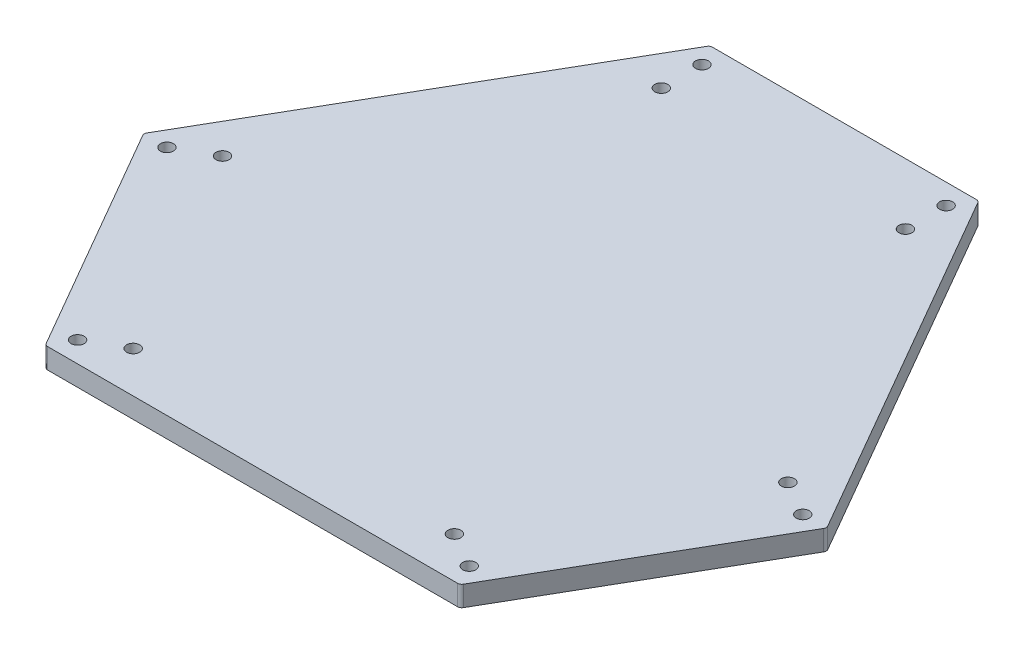
ISO-10303-21;
HEADER;
FILE_DESCRIPTION(('STEP AP214'),'2;1');
FILE_NAME('part.step','',(''),(''),'','','');
FILE_SCHEMA(('AUTOMOTIVE_DESIGN { 1 0 10303 214 1 1 1 1 }'));
ENDSEC;
DATA;
#1=APPLICATION_CONTEXT('core data for automotive mechanical design processes');
#2=APPLICATION_PROTOCOL_DEFINITION('international standard','automotive_design',2000,#1);
#3=PRODUCT_CONTEXT('',#1,'mechanical');
#4=PRODUCT('Part','Part','',(#3));
#5=PRODUCT_RELATED_PRODUCT_CATEGORY('part','',(#4));
#6=PRODUCT_DEFINITION_FORMATION('','',#4);
#7=PRODUCT_DEFINITION_CONTEXT('part definition',#1,'design');
#8=PRODUCT_DEFINITION('design','',#6,#7);
#9=PRODUCT_DEFINITION_SHAPE('','',#8);
#10=(LENGTH_UNIT() NAMED_UNIT(*) SI_UNIT(.MILLI.,.METRE.));
#11=(NAMED_UNIT(*) PLANE_ANGLE_UNIT() SI_UNIT($,.RADIAN.));
#12=(NAMED_UNIT(*) SI_UNIT($,.STERADIAN.) SOLID_ANGLE_UNIT());
#13=UNCERTAINTY_MEASURE_WITH_UNIT(LENGTH_MEASURE(1.E-05),#10,'distance_accuracy_value','');
#14=(GEOMETRIC_REPRESENTATION_CONTEXT(3) GLOBAL_UNCERTAINTY_ASSIGNED_CONTEXT((#13)) GLOBAL_UNIT_ASSIGNED_CONTEXT((#10,
#11,#12)) REPRESENTATION_CONTEXT('',''));
#15=CARTESIAN_POINT('',(0.,0.,0.));
#16=DIRECTION('',(0.,0.,1.));
#17=DIRECTION('',(1.,0.,0.));
#18=AXIS2_PLACEMENT_3D('',#15,#16,#17);
#19=CARTESIAN_POINT('',(-33.,2.5,-77.8999999999996));
#20=DIRECTION('',(0.86602540378444,0.,0.499999999999997));
#21=DIRECTION('',(0.499999999999997,0.,-0.86602540378444));
#22=AXIS2_PLACEMENT_3D('',#19,#20,#21);
#23=PLANE('',#22);
#24=DIRECTION('',(-0.499999999999997,0.,0.86602540378444));
#25=VECTOR('',#24,1.);
#26=CARTESIAN_POINT('',(-33.,2.5,-77.8999999999996));
#27=LINE('',#26,#25);
#28=CARTESIAN_POINT('',(-33.2886751345948,2.5,-77.3999999999996));
#29=VERTEX_POINT('',#28);
#30=CARTESIAN_POINT('',(-83.6747038202125,2.5,9.87116167511386));
#31=VERTEX_POINT('',#30);
#32=EDGE_CURVE('E149',#29,#31,#27,.T.);
#33=ORIENTED_EDGE('',*,*,#32,.F.);
#34=DIRECTION('',(0.,-1.,0.));
#35=VECTOR('',#34,1.);
#36=CARTESIAN_POINT('',(-33.2886751345948,2.5,-77.3999999999996));
#37=LINE('',#36,#35);
#38=CARTESIAN_POINT('',(-33.2886751345948,-2.5,-77.3999999999996));
#39=VERTEX_POINT('',#38);
#40=EDGE_CURVE('E134',#29,#39,#37,.T.);
#41=ORIENTED_EDGE('',*,*,#40,.T.);
#42=DIRECTION('',(-0.499999999999997,0.,0.86602540378444));
#43=VECTOR('',#42,1.);
#44=CARTESIAN_POINT('',(-33.,-2.5,-77.8999999999996));
#45=LINE('',#44,#43);
#46=CARTESIAN_POINT('',(-83.6747038202125,-2.5,9.87116167511386));
#47=VERTEX_POINT('',#46);
#48=EDGE_CURVE('E146',#39,#47,#45,.T.);
#49=ORIENTED_EDGE('',*,*,#48,.T.);
#50=DIRECTION('',(0.,-1.,0.));
#51=VECTOR('',#50,1.);
#52=CARTESIAN_POINT('',(-83.6747038202125,2.5,9.87116167511386));
#53=LINE('',#52,#51);
#54=EDGE_CURVE('E151',#47,#31,#53,.F.);
#55=ORIENTED_EDGE('',*,*,#54,.T.);
#56=EDGE_LOOP('',(#33,#41,#49,#55));
#57=FACE_BOUND('',#56,.T.);
#58=ADVANCED_FACE('F39',(#57),#23,.F.);
#59=CARTESIAN_POINT('',(-83.9633789548074,2.5,10.3711616751139));
#60=DIRECTION('',(0.866025403784435,0.,-0.500000000000006));
#61=DIRECTION('',(-0.500000000000006,0.,-0.866025403784435));
#62=AXIS2_PLACEMENT_3D('',#59,#60,#61);
#63=PLANE('',#62);
#64=DIRECTION('',(0.500000000000005,0.,0.866025403784435));
#65=VECTOR('',#64,1.);
#66=CARTESIAN_POINT('',(-83.9633789548074,2.5,10.3711616751139));
#67=LINE('',#66,#65);
#68=CARTESIAN_POINT('',(-83.6747038202125,2.5,10.8711616751139));
#69=VERTEX_POINT('',#68);
#70=CARTESIAN_POINT('',(-51.2520540894018,2.5,67.0288383248866));
#71=VERTEX_POINT('',#70);
#72=EDGE_CURVE('E218',#69,#71,#67,.T.);
#73=ORIENTED_EDGE('',*,*,#72,.F.);
#74=DIRECTION('',(0.,-1.,0.));
#75=VECTOR('',#74,1.);
#76=CARTESIAN_POINT('',(-83.6747038202125,2.5,10.8711616751139));
#77=LINE('',#76,#75);
#78=CARTESIAN_POINT('',(-83.6747038202125,-2.5,10.8711616751139));
#79=VERTEX_POINT('',#78);
#80=EDGE_CURVE('E11',#69,#79,#77,.T.);
#81=ORIENTED_EDGE('',*,*,#80,.T.);
#82=DIRECTION('',(0.500000000000005,0.,0.866025403784435));
#83=VECTOR('',#82,1.);
#84=CARTESIAN_POINT('',(-83.9633789548074,-2.5,10.3711616751139));
#85=LINE('',#84,#83);
#86=CARTESIAN_POINT('',(-51.2520540894018,-2.5,67.0288383248866));
#87=VERTEX_POINT('',#86);
#88=EDGE_CURVE('E156',#79,#87,#85,.T.);
#89=ORIENTED_EDGE('',*,*,#88,.T.);
#90=DIRECTION('',(0.,-1.,0.));
#91=VECTOR('',#90,1.);
#92=CARTESIAN_POINT('',(-51.2520540894018,2.5,67.0288383248866));
#93=LINE('',#92,#91);
#94=EDGE_CURVE('E47',#87,#71,#93,.F.);
#95=ORIENTED_EDGE('',*,*,#94,.T.);
#96=EDGE_LOOP('',(#73,#81,#89,#95));
#97=FACE_BOUND('',#96,.T.);
#98=ADVANCED_FACE('F217',(#97),#63,.F.);
#99=CARTESIAN_POINT('',(-50.963378954807,2.5,67.5288383248866));
#100=DIRECTION('',(0.,0.,-1.));
#101=DIRECTION('',(-1.,0.,0.));
#102=AXIS2_PLACEMENT_3D('',#99,#100,#101);
#103=PLANE('',#102);
#104=DIRECTION('',(1.,0.,0.));
#105=VECTOR('',#104,1.);
#106=CARTESIAN_POINT('',(-50.963378954807,-2.5,67.5288383248866));
#107=LINE('',#106,#105);
#108=CARTESIAN_POINT('',(-50.3860286856174,-2.5,67.5288383248866));
#109=VERTEX_POINT('',#108);
#110=CARTESIAN_POINT('',(50.3860286856174,-2.5,67.5288383248866));
#111=VERTEX_POINT('',#110);
#112=EDGE_CURVE('E160',#109,#111,#107,.T.);
#113=ORIENTED_EDGE('',*,*,#112,.T.);
#114=DIRECTION('',(0.,-1.,0.));
#115=VECTOR('',#114,1.);
#116=CARTESIAN_POINT('',(50.3860286856174,2.5,67.5288383248866));
#117=LINE('',#116,#115);
#118=CARTESIAN_POINT('',(50.3860286856174,2.5,67.5288383248866));
#119=VERTEX_POINT('',#118);
#120=EDGE_CURVE('E212',#111,#119,#117,.F.);
#121=ORIENTED_EDGE('',*,*,#120,.T.);
#122=DIRECTION('',(1.,0.,0.));
#123=VECTOR('',#122,1.);
#124=CARTESIAN_POINT('',(-50.963378954807,2.5,67.5288383248866));
#125=LINE('',#124,#123);
#126=CARTESIAN_POINT('',(-50.3860286856174,2.5,67.5288383248866));
#127=VERTEX_POINT('',#126);
#128=EDGE_CURVE('E227',#127,#119,#125,.T.);
#129=ORIENTED_EDGE('',*,*,#128,.F.);
#130=DIRECTION('',(0.,-1.,0.));
#131=VECTOR('',#130,1.);
#132=CARTESIAN_POINT('',(-50.3860286856174,2.5,67.5288383248866));
#133=LINE('',#132,#131);
#134=EDGE_CURVE('E209',#127,#109,#133,.T.);
#135=ORIENTED_EDGE('',*,*,#134,.T.);
#136=EDGE_LOOP('',(#113,#121,#129,#135));
#137=FACE_BOUND('',#136,.T.);
#138=ADVANCED_FACE('F232',(#137),#103,.F.);
#139=CARTESIAN_POINT('',(50.963378954807,2.5,67.5288383248866));
#140=DIRECTION('',(-0.866025403784435,0.,-0.500000000000006));
#141=DIRECTION('',(-0.500000000000006,0.,0.866025403784435));
#142=AXIS2_PLACEMENT_3D('',#139,#140,#141);
#143=PLANE('',#142);
#144=DIRECTION('',(0.500000000000005,0.,-0.866025403784435));
#145=VECTOR('',#144,1.);
#146=CARTESIAN_POINT('',(50.963378954807,-2.5,67.5288383248866));
#147=LINE('',#146,#145);
#148=CARTESIAN_POINT('',(51.2520540894018,-2.5,67.0288383248866));
#149=VERTEX_POINT('',#148);
#150=CARTESIAN_POINT('',(83.6747038202125,-2.5,10.8711616751139));
#151=VERTEX_POINT('',#150);
#152=EDGE_CURVE('E171',#149,#151,#147,.T.);
#153=ORIENTED_EDGE('',*,*,#152,.T.);
#154=DIRECTION('',(0.,-1.,0.));
#155=VECTOR('',#154,1.);
#156=CARTESIAN_POINT('',(83.6747038202125,2.5,10.8711616751139));
#157=LINE('',#156,#155);
#158=CARTESIAN_POINT('',(83.6747038202125,2.5,10.8711616751139));
#159=VERTEX_POINT('',#158);
#160=EDGE_CURVE('E207',#151,#159,#157,.F.);
#161=ORIENTED_EDGE('',*,*,#160,.T.);
#162=DIRECTION('',(0.500000000000005,0.,-0.866025403784435));
#163=VECTOR('',#162,1.);
#164=CARTESIAN_POINT('',(50.963378954807,2.5,67.5288383248866));
#165=LINE('',#164,#163);
#166=CARTESIAN_POINT('',(51.2520540894018,2.5,67.0288383248866));
#167=VERTEX_POINT('',#166);
#168=EDGE_CURVE('E243',#167,#159,#165,.T.);
#169=ORIENTED_EDGE('',*,*,#168,.F.);
#170=DIRECTION('',(0.,-1.,0.));
#171=VECTOR('',#170,1.);
#172=CARTESIAN_POINT('',(51.2520540894018,2.5,67.0288383248866));
#173=LINE('',#172,#171);
#174=EDGE_CURVE('E204',#167,#149,#173,.T.);
#175=ORIENTED_EDGE('',*,*,#174,.T.);
#176=EDGE_LOOP('',(#153,#161,#169,#175));
#177=FACE_BOUND('',#176,.T.);
#178=ADVANCED_FACE('F241',(#177),#143,.F.);
#179=CARTESIAN_POINT('',(83.9633789548074,2.5,10.3711616751139));
#180=DIRECTION('',(-0.86602540378444,0.,0.499999999999997));
#181=DIRECTION('',(0.499999999999997,0.,0.86602540378444));
#182=AXIS2_PLACEMENT_3D('',#179,#180,#181);
#183=PLANE('',#182);
#184=DIRECTION('',(-0.499999999999997,0.,-0.86602540378444));
#185=VECTOR('',#184,1.);
#186=CARTESIAN_POINT('',(83.9633789548074,-2.5,10.3711616751139));
#187=LINE('',#186,#185);
#188=CARTESIAN_POINT('',(83.6747038202125,-2.5,9.87116167511386));
#189=VERTEX_POINT('',#188);
#190=CARTESIAN_POINT('',(33.2886751345948,-2.5,-77.3999999999996));
#191=VERTEX_POINT('',#190);
#192=EDGE_CURVE('E174',#189,#191,#187,.T.);
#193=ORIENTED_EDGE('',*,*,#192,.T.);
#194=DIRECTION('',(0.,-1.,0.));
#195=VECTOR('',#194,1.);
#196=CARTESIAN_POINT('',(33.2886751345948,2.5,-77.3999999999996));
#197=LINE('',#196,#195);
#198=CARTESIAN_POINT('',(33.2886751345948,2.5,-77.3999999999996));
#199=VERTEX_POINT('',#198);
#200=EDGE_CURVE('E54',#191,#199,#197,.F.);
#201=ORIENTED_EDGE('',*,*,#200,.T.);
#202=DIRECTION('',(-0.499999999999997,0.,-0.86602540378444));
#203=VECTOR('',#202,1.);
#204=CARTESIAN_POINT('',(83.9633789548074,2.5,10.3711616751139));
#205=LINE('',#204,#203);
#206=CARTESIAN_POINT('',(83.6747038202125,2.5,9.87116167511386));
#207=VERTEX_POINT('',#206);
#208=EDGE_CURVE('E244',#207,#199,#205,.T.);
#209=ORIENTED_EDGE('',*,*,#208,.F.);
#210=DIRECTION('',(0.,-1.,0.));
#211=VECTOR('',#210,1.);
#212=CARTESIAN_POINT('',(83.6747038202125,2.5,9.87116167511386));
#213=LINE('',#212,#211);
#214=EDGE_CURVE('E200',#207,#189,#213,.T.);
#215=ORIENTED_EDGE('',*,*,#214,.T.);
#216=EDGE_LOOP('',(#193,#201,#209,#215));
#217=FACE_BOUND('',#216,.T.);
#218=ADVANCED_FACE('F364',(#217),#183,.F.);
#219=CARTESIAN_POINT('',(33.,2.5,-77.8999999999996));
#220=DIRECTION('',(0.,0.,1.));
#221=DIRECTION('',(1.,0.,0.));
#222=AXIS2_PLACEMENT_3D('',#219,#220,#221);
#223=PLANE('',#222);
#224=DIRECTION('',(-1.,0.,0.));
#225=VECTOR('',#224,1.);
#226=CARTESIAN_POINT('',(33.,-2.5,-77.8999999999996));
#227=LINE('',#226,#225);
#228=CARTESIAN_POINT('',(32.4226497308104,-2.5,-77.8999999999996));
#229=VERTEX_POINT('',#228);
#230=CARTESIAN_POINT('',(-32.4226497308104,-2.5,-77.8999999999996));
#231=VERTEX_POINT('',#230);
#232=EDGE_CURVE('E176',#229,#231,#227,.T.);
#233=ORIENTED_EDGE('',*,*,#232,.T.);
#234=DIRECTION('',(0.,-1.,0.));
#235=VECTOR('',#234,1.);
#236=CARTESIAN_POINT('',(-32.4226497308104,2.5,-77.8999999999996));
#237=LINE('',#236,#235);
#238=CARTESIAN_POINT('',(-32.4226497308104,2.5,-77.8999999999996));
#239=VERTEX_POINT('',#238);
#240=EDGE_CURVE('E135',#231,#239,#237,.F.);
#241=ORIENTED_EDGE('',*,*,#240,.T.);
#242=DIRECTION('',(-1.,0.,0.));
#243=VECTOR('',#242,1.);
#244=CARTESIAN_POINT('',(33.,2.5,-77.8999999999996));
#245=LINE('',#244,#243);
#246=CARTESIAN_POINT('',(32.4226497308104,2.5,-77.8999999999996));
#247=VERTEX_POINT('',#246);
#248=EDGE_CURVE('E166',#247,#239,#245,.T.);
#249=ORIENTED_EDGE('',*,*,#248,.F.);
#250=DIRECTION('',(0.,-1.,0.));
#251=VECTOR('',#250,1.);
#252=CARTESIAN_POINT('',(32.4226497308104,2.5,-77.8999999999996));
#253=LINE('',#252,#251);
#254=EDGE_CURVE('E140',#247,#229,#253,.T.);
#255=ORIENTED_EDGE('',*,*,#254,.T.);
#256=EDGE_LOOP('',(#233,#241,#249,#255));
#257=FACE_BOUND('',#256,.T.);
#258=ADVANCED_FACE('F362',(#257),#223,.F.);
#259=CARTESIAN_POINT('',(0.,2.5,0.));
#260=DIRECTION('',(0.,1.,0.));
#261=DIRECTION('',(0.,0.,1.));
#262=AXIS2_PLACEMENT_3D('',#259,#260,#261);
#263=PLANE('',#262);
#264=CARTESIAN_POINT('',(78.1332519358863,2.5,10.4692378864667));
#265=DIRECTION('',(0.,1.,0.));
#266=DIRECTION('',(0.,0.,1.));
#267=AXIS2_PLACEMENT_3D('',#264,#265,#266);
#268=CIRCLE('',#267,1.60000000000066);
#269=CARTESIAN_POINT('',(78.1332519358863,2.5,12.0692378864674));
#270=VERTEX_POINT('',#269);
#271=EDGE_CURVE('E265',#270,#270,#268,.T.);
#272=ORIENTED_EDGE('',*,*,#271,.F.);
#273=EDGE_LOOP('',(#272));
#274=FACE_BOUND('',#273,.T.);
#275=CARTESIAN_POINT('',(-78.1332519358865,2.5,10.4692378864657));
#276=DIRECTION('',(0.,1.,0.));
#277=DIRECTION('',(0.,0.,1.));
#278=AXIS2_PLACEMENT_3D('',#275,#276,#277);
#279=CIRCLE('',#278,1.60000000000119);
#280=CARTESIAN_POINT('',(-78.1332519358865,2.5,12.0692378864668));
#281=VERTEX_POINT('',#280);
#282=EDGE_CURVE('E272',#281,#281,#279,.T.);
#283=ORIENTED_EDGE('',*,*,#282,.F.);
#284=EDGE_LOOP('',(#283));
#285=FACE_BOUND('',#284,.T.);
#286=CARTESIAN_POINT('',(-69.4729978980421,2.5,5.46923788646574));
#287=DIRECTION('',(0.,1.,0.));
#288=DIRECTION('',(0.,0.,1.));
#289=AXIS2_PLACEMENT_3D('',#286,#287,#288);
#290=CIRCLE('',#289,1.60000000000113);
#291=CARTESIAN_POINT('',(-69.4729978980421,2.5,7.06923788646686));
#292=VERTEX_POINT('',#291);
#293=EDGE_CURVE('E275',#292,#292,#290,.T.);
#294=ORIENTED_EDGE('',*,*,#293,.F.);
#295=EDGE_LOOP('',(#294));
#296=FACE_BOUND('',#295,.T.);
#297=CARTESIAN_POINT('',(-39.4729978980417,2.5,57.4307621135337));
#298=DIRECTION('',(0.,1.,0.));
#299=DIRECTION('',(0.,0.,1.));
#300=AXIS2_PLACEMENT_3D('',#297,#298,#299);
#301=CIRCLE('',#300,1.60000000000066);
#302=CARTESIAN_POINT('',(-39.4729978980417,2.5,59.0307621135344));
#303=VERTEX_POINT('',#302);
#304=EDGE_CURVE('E278',#303,#303,#301,.T.);
#305=ORIENTED_EDGE('',*,*,#304,.F.);
#306=EDGE_LOOP('',(#305));
#307=FACE_BOUND('',#306,.T.);
#308=CARTESIAN_POINT('',(-48.1332519358862,2.5,62.4307621135336));
#309=DIRECTION('',(0.,1.,0.));
#310=DIRECTION('',(0.,0.,1.));
#311=AXIS2_PLACEMENT_3D('',#308,#309,#310);
#312=CIRCLE('',#311,1.60000000000066);
#313=CARTESIAN_POINT('',(-48.1332519358862,2.5,64.0307621135343));
#314=VERTEX_POINT('',#313);
#315=EDGE_CURVE('E281',#314,#314,#312,.T.);
#316=ORIENTED_EDGE('',*,*,#315,.F.);
#317=EDGE_LOOP('',(#316));
#318=FACE_BOUND('',#317,.T.);
#319=CARTESIAN_POINT('',(48.1332519358853,2.5,62.4307621135343));
#320=DIRECTION('',(0.,1.,0.));
#321=DIRECTION('',(0.,0.,1.));
#322=AXIS2_PLACEMENT_3D('',#319,#320,#321);
#323=CIRCLE('',#322,1.60000000000119);
#324=CARTESIAN_POINT('',(48.1332519358853,2.5,64.0307621135355));
#325=VERTEX_POINT('',#324);
#326=EDGE_CURVE('E284',#325,#325,#323,.T.);
#327=ORIENTED_EDGE('',*,*,#326,.F.);
#328=EDGE_LOOP('',(#327));
#329=FACE_BOUND('',#328,.T.);
#330=CARTESIAN_POINT('',(39.472997898041,2.5,57.4307621135343));
#331=DIRECTION('',(0.,1.,0.));
#332=DIRECTION('',(0.,0.,1.));
#333=AXIS2_PLACEMENT_3D('',#330,#331,#332);
#334=CIRCLE('',#333,1.60000000000113);
#335=CARTESIAN_POINT('',(39.472997898041,2.5,59.0307621135354));
#336=VERTEX_POINT('',#335);
#337=EDGE_CURVE('E287',#336,#336,#334,.T.);
#338=ORIENTED_EDGE('',*,*,#337,.F.);
#339=EDGE_LOOP('',(#338));
#340=FACE_BOUND('',#339,.T.);
#341=CARTESIAN_POINT('',(69.472997898042,2.5,5.4692378864667));
#342=DIRECTION('',(0.,1.,0.));
#343=DIRECTION('',(0.,0.,1.));
#344=AXIS2_PLACEMENT_3D('',#341,#342,#343);
#345=CIRCLE('',#344,1.60000000000066);
#346=CARTESIAN_POINT('',(69.472997898042,2.5,7.06923788646736));
#347=VERTEX_POINT('',#346);
#348=EDGE_CURVE('E290',#347,#347,#345,.T.);
#349=ORIENTED_EDGE('',*,*,#348,.F.);
#350=EDGE_LOOP('',(#349));
#351=FACE_BOUND('',#350,.T.);
#352=CARTESIAN_POINT('',(30.0000000000008,2.5,-72.9000000000005));
#353=DIRECTION('',(0.,1.,0.));
#354=DIRECTION('',(0.,0.,1.));
#355=AXIS2_PLACEMENT_3D('',#352,#353,#354);
#356=CIRCLE('',#355,1.60000000000119);
#357=CARTESIAN_POINT('',(30.0000000000008,2.5,-71.2999999999993));
#358=VERTEX_POINT('',#357);
#359=EDGE_CURVE('E157',#358,#358,#356,.T.);
#360=ORIENTED_EDGE('',*,*,#359,.F.);
#361=EDGE_LOOP('',(#360));
#362=FACE_BOUND('',#361,.T.);
#363=CARTESIAN_POINT('',(30.0000000000008,2.5,-62.9000000000005));
#364=DIRECTION('',(0.,1.,0.));
#365=DIRECTION('',(0.,0.,1.));
#366=AXIS2_PLACEMENT_3D('',#363,#364,#365);
#367=CIRCLE('',#366,1.60000000000113);
#368=CARTESIAN_POINT('',(30.0000000000008,2.5,-61.2999999999994));
#369=VERTEX_POINT('',#368);
#370=EDGE_CURVE('E163',#369,#369,#367,.T.);
#371=ORIENTED_EDGE('',*,*,#370,.F.);
#372=EDGE_LOOP('',(#371));
#373=FACE_BOUND('',#372,.T.);
#374=CARTESIAN_POINT('',(-30.0000000000008,2.5,-62.9000000000005));
#375=DIRECTION('',(0.,1.,0.));
#376=DIRECTION('',(0.,0.,1.));
#377=AXIS2_PLACEMENT_3D('',#374,#375,#376);
#378=CIRCLE('',#377,1.60000000000066);
#379=CARTESIAN_POINT('',(-30.0000000000008,2.5,-61.2999999999998));
#380=VERTEX_POINT('',#379);
#381=EDGE_CURVE('E251',#380,#380,#378,.T.);
#382=ORIENTED_EDGE('',*,*,#381,.F.);
#383=EDGE_LOOP('',(#382));
#384=FACE_BOUND('',#383,.T.);
#385=CARTESIAN_POINT('',(-30.0000000000008,2.5,-72.9000000000005));
#386=DIRECTION('',(0.,1.,0.));
#387=DIRECTION('',(0.,0.,1.));
#388=AXIS2_PLACEMENT_3D('',#385,#386,#387);
#389=CIRCLE('',#388,1.60000000000066);
#390=CARTESIAN_POINT('',(-30.0000000000008,2.5,-71.2999999999998));
#391=VERTEX_POINT('',#390);
#392=EDGE_CURVE('E254',#391,#391,#389,.T.);
#393=ORIENTED_EDGE('',*,*,#392,.F.);
#394=EDGE_LOOP('',(#393));
#395=FACE_BOUND('',#394,.T.);
#396=ORIENTED_EDGE('',*,*,#248,.T.);
#397=CARTESIAN_POINT('',(-32.4226497308104,2.5,-76.8999999999996));
#398=DIRECTION('',(0.,1.,0.));
#399=DIRECTION('',(0.,0.,1.));
#400=AXIS2_PLACEMENT_3D('',#397,#398,#399);
#401=CIRCLE('',#400,1.);
#402=EDGE_CURVE('E198',#239,#29,#401,.T.);
#403=ORIENTED_EDGE('',*,*,#402,.T.);
#404=ORIENTED_EDGE('',*,*,#32,.T.);
#405=CARTESIAN_POINT('',(-82.8086784164281,2.5,10.3711616751139));
#406=DIRECTION('',(0.,1.,0.));
#407=DIRECTION('',(0.,0.,1.));
#408=AXIS2_PLACEMENT_3D('',#405,#406,#407);
#409=CIRCLE('',#408,1.);
#410=EDGE_CURVE('E191',#31,#69,#409,.T.);
#411=ORIENTED_EDGE('',*,*,#410,.T.);
#412=ORIENTED_EDGE('',*,*,#72,.T.);
#413=CARTESIAN_POINT('',(-50.3860286856174,2.5,66.5288383248866));
#414=DIRECTION('',(0.,1.,0.));
#415=DIRECTION('',(0.,0.,1.));
#416=AXIS2_PLACEMENT_3D('',#413,#414,#415);
#417=CIRCLE('',#416,1.);
#418=EDGE_CURVE('E189',#71,#127,#417,.T.);
#419=ORIENTED_EDGE('',*,*,#418,.T.);
#420=ORIENTED_EDGE('',*,*,#128,.T.);
#421=CARTESIAN_POINT('',(50.3860286856174,2.5,66.5288383248866));
#422=DIRECTION('',(0.,1.,0.));
#423=DIRECTION('',(0.,0.,1.));
#424=AXIS2_PLACEMENT_3D('',#421,#422,#423);
#425=CIRCLE('',#424,1.);
#426=EDGE_CURVE('E193',#119,#167,#425,.T.);
#427=ORIENTED_EDGE('',*,*,#426,.T.);
#428=ORIENTED_EDGE('',*,*,#168,.T.);
#429=CARTESIAN_POINT('',(82.8086784164281,2.5,10.3711616751139));
#430=DIRECTION('',(0.,1.,0.));
#431=DIRECTION('',(0.,0.,1.));
#432=AXIS2_PLACEMENT_3D('',#429,#430,#431);
#433=CIRCLE('',#432,1.);
#434=EDGE_CURVE('E61',#159,#207,#433,.T.);
#435=ORIENTED_EDGE('',*,*,#434,.T.);
#436=ORIENTED_EDGE('',*,*,#208,.T.);
#437=CARTESIAN_POINT('',(32.4226497308104,2.5,-76.8999999999996));
#438=DIRECTION('',(0.,1.,0.));
#439=DIRECTION('',(0.,0.,1.));
#440=AXIS2_PLACEMENT_3D('',#437,#438,#439);
#441=CIRCLE('',#440,1.);
#442=EDGE_CURVE('E196',#199,#247,#441,.T.);
#443=ORIENTED_EDGE('',*,*,#442,.T.);
#444=EDGE_LOOP('',(#396,#403,#404,#411,#412,#419,#420,#427,#428,#435,#436,#443));
#445=FACE_BOUND('',#444,.T.);
#446=ADVANCED_FACE('F223',(#274,#285,#296,#307,#318,#329,#340,#351,#362,#373,#384,#395,#445),
#263,.T.);
#447=CARTESIAN_POINT('',(0.,-2.5,0.));
#448=DIRECTION('',(0.,1.,0.));
#449=DIRECTION('',(0.,0.,1.));
#450=AXIS2_PLACEMENT_3D('',#447,#448,#449);
#451=PLANE('',#450);
#452=CARTESIAN_POINT('',(78.1332519358863,-2.5,10.4692378864667));
#453=DIRECTION('',(0.,1.,0.));
#454=DIRECTION('',(-0.866025403784436,0.,-0.500000000000004));
#455=AXIS2_PLACEMENT_3D('',#452,#453,#454);
#456=CIRCLE('',#455,1.60000000000066);
#457=CARTESIAN_POINT('',(76.7476112898307,-2.5,9.66923788646641));
#458=VERTEX_POINT('',#457);
#459=EDGE_CURVE('E293',#458,#458,#456,.T.);
#460=ORIENTED_EDGE('',*,*,#459,.T.);
#461=EDGE_LOOP('',(#460));
#462=FACE_BOUND('',#461,.T.);
#463=CARTESIAN_POINT('',(-78.1332519358865,-2.5,10.4692378864657));
#464=DIRECTION('',(0.,1.,0.));
#465=DIRECTION('',(-0.866025403784443,0.,0.499999999999992));
#466=AXIS2_PLACEMENT_3D('',#463,#464,#465);
#467=CIRCLE('',#466,1.60000000000119);
#468=CARTESIAN_POINT('',(-79.5188925819426,-2.5,11.2692378864662));
#469=VERTEX_POINT('',#468);
#470=EDGE_CURVE('E307',#469,#469,#467,.T.);
#471=ORIENTED_EDGE('',*,*,#470,.T.);
#472=EDGE_LOOP('',(#471));
#473=FACE_BOUND('',#472,.T.);
#474=CARTESIAN_POINT('',(-69.4729978980421,-2.5,5.46923788646574));
#475=DIRECTION('',(0.,1.,0.));
#476=DIRECTION('',(-0.866025403784443,0.,0.499999999999992));
#477=AXIS2_PLACEMENT_3D('',#474,#475,#476);
#478=CIRCLE('',#477,1.60000000000113);
#479=CARTESIAN_POINT('',(-70.8586385440982,-2.5,6.26923788646629));
#480=VERTEX_POINT('',#479);
#481=EDGE_CURVE('E310',#480,#480,#478,.T.);
#482=ORIENTED_EDGE('',*,*,#481,.T.);
#483=EDGE_LOOP('',(#482));
#484=FACE_BOUND('',#483,.T.);
#485=CARTESIAN_POINT('',(-39.4729978980417,-2.5,57.4307621135337));
#486=DIRECTION('',(0.,1.,0.));
#487=DIRECTION('',(0.866025403784443,0.,-0.499999999999992));
#488=AXIS2_PLACEMENT_3D('',#485,#486,#487);
#489=CIRCLE('',#488,1.60000000000066);
#490=CARTESIAN_POINT('',(-38.087357251986,-2.5,56.6307621135334));
#491=VERTEX_POINT('',#490);
#492=EDGE_CURVE('E298',#491,#491,#489,.T.);
#493=ORIENTED_EDGE('',*,*,#492,.T.);
#494=EDGE_LOOP('',(#493));
#495=FACE_BOUND('',#494,.T.);
#496=CARTESIAN_POINT('',(-48.1332519358862,-2.5,62.4307621135336));
#497=DIRECTION('',(0.,1.,0.));
#498=DIRECTION('',(0.866025403784443,0.,-0.499999999999992));
#499=AXIS2_PLACEMENT_3D('',#496,#497,#498);
#500=CIRCLE('',#499,1.60000000000066);
#501=CARTESIAN_POINT('',(-46.7476112898305,-2.5,61.6307621135333));
#502=VERTEX_POINT('',#501);
#503=EDGE_CURVE('E294',#502,#502,#500,.T.);
#504=ORIENTED_EDGE('',*,*,#503,.T.);
#505=EDGE_LOOP('',(#504));
#506=FACE_BOUND('',#505,.T.);
#507=CARTESIAN_POINT('',(48.1332519358853,-2.5,62.4307621135343));
#508=DIRECTION('',(0.,1.,0.));
#509=DIRECTION('',(0.866025403784436,0.,0.500000000000004));
#510=AXIS2_PLACEMENT_3D('',#507,#508,#509);
#511=CIRCLE('',#510,1.60000000000119);
#512=CARTESIAN_POINT('',(49.5188925819414,-2.5,63.2307621135349));
#513=VERTEX_POINT('',#512);
#514=EDGE_CURVE('E297',#513,#513,#511,.T.);
#515=ORIENTED_EDGE('',*,*,#514,.T.);
#516=EDGE_LOOP('',(#515));
#517=FACE_BOUND('',#516,.T.);
#518=CARTESIAN_POINT('',(39.472997898041,-2.5,57.4307621135343));
#519=DIRECTION('',(0.,1.,0.));
#520=DIRECTION('',(0.866025403784436,0.,0.500000000000004));
#521=AXIS2_PLACEMENT_3D('',#518,#519,#520);
#522=CIRCLE('',#521,1.60000000000113);
#523=CARTESIAN_POINT('',(40.858638544097,-2.5,58.2307621135349));
#524=VERTEX_POINT('',#523);
#525=EDGE_CURVE('E301',#524,#524,#522,.T.);
#526=ORIENTED_EDGE('',*,*,#525,.T.);
#527=EDGE_LOOP('',(#526));
#528=FACE_BOUND('',#527,.T.);
#529=CARTESIAN_POINT('',(69.472997898042,-2.5,5.4692378864667));
#530=DIRECTION('',(0.,1.,0.));
#531=DIRECTION('',(-0.866025403784436,0.,-0.500000000000004));
#532=AXIS2_PLACEMENT_3D('',#529,#530,#531);
#533=CIRCLE('',#532,1.60000000000066);
#534=CARTESIAN_POINT('',(68.0873572519863,-2.5,4.66923788646637));
#535=VERTEX_POINT('',#534);
#536=EDGE_CURVE('E304',#535,#535,#533,.T.);
#537=ORIENTED_EDGE('',*,*,#536,.T.);
#538=EDGE_LOOP('',(#537));
#539=FACE_BOUND('',#538,.T.);
#540=CARTESIAN_POINT('',(30.0000000000008,-2.5,-72.9000000000005));
#541=DIRECTION('',(0.,1.,0.));
#542=DIRECTION('',(0.,0.,-1.));
#543=AXIS2_PLACEMENT_3D('',#540,#541,#542);
#544=CIRCLE('',#543,1.60000000000119);
#545=CARTESIAN_POINT('',(30.0000000000008,-2.5,-74.5000000000017));
#546=VERTEX_POINT('',#545);
#547=EDGE_CURVE('E261',#546,#546,#544,.T.);
#548=ORIENTED_EDGE('',*,*,#547,.T.);
#549=EDGE_LOOP('',(#548));
#550=FACE_BOUND('',#549,.T.);
#551=CARTESIAN_POINT('',(30.0000000000008,-2.5,-62.9000000000005));
#552=DIRECTION('',(0.,1.,0.));
#553=DIRECTION('',(0.,0.,-1.));
#554=AXIS2_PLACEMENT_3D('',#551,#552,#553);
#555=CIRCLE('',#554,1.60000000000113);
#556=CARTESIAN_POINT('',(30.0000000000008,-2.5,-64.5000000000016));
#557=VERTEX_POINT('',#556);
#558=EDGE_CURVE('E264',#557,#557,#555,.T.);
#559=ORIENTED_EDGE('',*,*,#558,.T.);
#560=EDGE_LOOP('',(#559));
#561=FACE_BOUND('',#560,.T.);
#562=CARTESIAN_POINT('',(-30.0000000000008,-2.5,-62.9000000000005));
#563=DIRECTION('',(0.,1.,0.));
#564=DIRECTION('',(0.,0.,1.));
#565=AXIS2_PLACEMENT_3D('',#562,#563,#564);
#566=CIRCLE('',#565,1.60000000000066);
#567=CARTESIAN_POINT('',(-30.0000000000008,-2.5,-61.2999999999998));
#568=VERTEX_POINT('',#567);
#569=EDGE_CURVE('E260',#568,#568,#566,.T.);
#570=ORIENTED_EDGE('',*,*,#569,.T.);
#571=EDGE_LOOP('',(#570));
#572=FACE_BOUND('',#571,.T.);
#573=CARTESIAN_POINT('',(-30.0000000000008,-2.5,-72.9000000000005));
#574=DIRECTION('',(0.,1.,0.));
#575=DIRECTION('',(0.,0.,1.));
#576=AXIS2_PLACEMENT_3D('',#573,#574,#575);
#577=CIRCLE('',#576,1.60000000000066);
#578=CARTESIAN_POINT('',(-30.0000000000008,-2.5,-71.2999999999998));
#579=VERTEX_POINT('',#578);
#580=EDGE_CURVE('E257',#579,#579,#577,.T.);
#581=ORIENTED_EDGE('',*,*,#580,.T.);
#582=EDGE_LOOP('',(#581));
#583=FACE_BOUND('',#582,.T.);
#584=ORIENTED_EDGE('',*,*,#48,.F.);
#585=CARTESIAN_POINT('',(-32.4226497308104,-2.5,-76.8999999999996));
#586=DIRECTION('',(0.,1.,0.));
#587=DIRECTION('',(0.,0.,1.));
#588=AXIS2_PLACEMENT_3D('',#585,#586,#587);
#589=CIRCLE('',#588,1.);
#590=EDGE_CURVE('E130',#39,#231,#589,.F.);
#591=ORIENTED_EDGE('',*,*,#590,.T.);
#592=ORIENTED_EDGE('',*,*,#232,.F.);
#593=CARTESIAN_POINT('',(32.4226497308104,-2.5,-76.8999999999996));
#594=DIRECTION('',(0.,1.,0.));
#595=DIRECTION('',(0.,0.,1.));
#596=AXIS2_PLACEMENT_3D('',#593,#594,#595);
#597=CIRCLE('',#596,1.);
#598=EDGE_CURVE('E141',#229,#191,#597,.F.);
#599=ORIENTED_EDGE('',*,*,#598,.T.);
#600=ORIENTED_EDGE('',*,*,#192,.F.);
#601=CARTESIAN_POINT('',(82.8086784164281,-2.5,10.3711616751139));
#602=DIRECTION('',(0.,1.,0.));
#603=DIRECTION('',(0.,0.,1.));
#604=AXIS2_PLACEMENT_3D('',#601,#602,#603);
#605=CIRCLE('',#604,1.);
#606=EDGE_CURVE('E183',#189,#151,#605,.F.);
#607=ORIENTED_EDGE('',*,*,#606,.T.);
#608=ORIENTED_EDGE('',*,*,#152,.F.);
#609=CARTESIAN_POINT('',(50.3860286856174,-2.5,66.5288383248866));
#610=DIRECTION('',(0.,1.,0.));
#611=DIRECTION('',(0.,0.,1.));
#612=AXIS2_PLACEMENT_3D('',#609,#610,#611);
#613=CIRCLE('',#612,1.);
#614=EDGE_CURVE('E181',#149,#111,#613,.F.);
#615=ORIENTED_EDGE('',*,*,#614,.T.);
#616=ORIENTED_EDGE('',*,*,#112,.F.);
#617=CARTESIAN_POINT('',(-50.3860286856174,-2.5,66.5288383248866));
#618=DIRECTION('',(0.,1.,0.));
#619=DIRECTION('',(0.,0.,1.));
#620=AXIS2_PLACEMENT_3D('',#617,#618,#619);
#621=CIRCLE('',#620,1.);
#622=EDGE_CURVE('E150',#109,#87,#621,.F.);
#623=ORIENTED_EDGE('',*,*,#622,.T.);
#624=ORIENTED_EDGE('',*,*,#88,.F.);
#625=CARTESIAN_POINT('',(-82.8086784164281,-2.5,10.3711616751139));
#626=DIRECTION('',(0.,1.,0.));
#627=DIRECTION('',(0.,0.,1.));
#628=AXIS2_PLACEMENT_3D('',#625,#626,#627);
#629=CIRCLE('',#628,1.);
#630=EDGE_CURVE('E155',#79,#47,#629,.F.);
#631=ORIENTED_EDGE('',*,*,#630,.T.);
#632=EDGE_LOOP('',(#584,#591,#592,#599,#600,#607,#608,#615,#616,#623,#624,#631));
#633=FACE_BOUND('',#632,.T.);
#634=ADVANCED_FACE('F153',(#462,#473,#484,#495,#506,#517,#528,#539,#550,#561,#572,#583,#633),
#451,.F.);
#635=CARTESIAN_POINT('',(-32.4226497308104,2.5,-76.8999999999996));
#636=DIRECTION('',(0.,-1.,0.));
#637=DIRECTION('',(0.,0.,-1.));
#638=AXIS2_PLACEMENT_3D('',#635,#636,#637);
#639=CYLINDRICAL_SURFACE('',#638,1.);
#640=ORIENTED_EDGE('',*,*,#402,.F.);
#641=ORIENTED_EDGE('',*,*,#240,.F.);
#642=ORIENTED_EDGE('',*,*,#590,.F.);
#643=ORIENTED_EDGE('',*,*,#40,.F.);
#644=EDGE_LOOP('',(#640,#641,#642,#643));
#645=FACE_BOUND('',#644,.T.);
#646=ADVANCED_FACE('F133',(#645),#639,.T.);
#647=CARTESIAN_POINT('',(32.4226497308104,2.5,-76.8999999999996));
#648=DIRECTION('',(0.,-1.,0.));
#649=DIRECTION('',(0.,0.,-1.));
#650=AXIS2_PLACEMENT_3D('',#647,#648,#649);
#651=CYLINDRICAL_SURFACE('',#650,1.);
#652=ORIENTED_EDGE('',*,*,#442,.F.);
#653=ORIENTED_EDGE('',*,*,#200,.F.);
#654=ORIENTED_EDGE('',*,*,#598,.F.);
#655=ORIENTED_EDGE('',*,*,#254,.F.);
#656=EDGE_LOOP('',(#652,#653,#654,#655));
#657=FACE_BOUND('',#656,.T.);
#658=ADVANCED_FACE('F342',(#657),#651,.T.);
#659=CARTESIAN_POINT('',(82.8086784164281,2.5,10.3711616751139));
#660=DIRECTION('',(0.,-1.,0.));
#661=DIRECTION('',(0.,0.,-1.));
#662=AXIS2_PLACEMENT_3D('',#659,#660,#661);
#663=CYLINDRICAL_SURFACE('',#662,1.);
#664=ORIENTED_EDGE('',*,*,#434,.F.);
#665=ORIENTED_EDGE('',*,*,#160,.F.);
#666=ORIENTED_EDGE('',*,*,#606,.F.);
#667=ORIENTED_EDGE('',*,*,#214,.F.);
#668=EDGE_LOOP('',(#664,#665,#666,#667));
#669=FACE_BOUND('',#668,.T.);
#670=ADVANCED_FACE('F345',(#669),#663,.T.);
#671=CARTESIAN_POINT('',(50.3860286856174,2.5,66.5288383248866));
#672=DIRECTION('',(0.,-1.,0.));
#673=DIRECTION('',(0.,0.,-1.));
#674=AXIS2_PLACEMENT_3D('',#671,#672,#673);
#675=CYLINDRICAL_SURFACE('',#674,1.);
#676=ORIENTED_EDGE('',*,*,#426,.F.);
#677=ORIENTED_EDGE('',*,*,#120,.F.);
#678=ORIENTED_EDGE('',*,*,#614,.F.);
#679=ORIENTED_EDGE('',*,*,#174,.F.);
#680=EDGE_LOOP('',(#676,#677,#678,#679));
#681=FACE_BOUND('',#680,.T.);
#682=ADVANCED_FACE('F238',(#681),#675,.T.);
#683=CARTESIAN_POINT('',(-82.8086784164281,2.5,10.3711616751139));
#684=DIRECTION('',(0.,-1.,0.));
#685=DIRECTION('',(0.,0.,-1.));
#686=AXIS2_PLACEMENT_3D('',#683,#684,#685);
#687=CYLINDRICAL_SURFACE('',#686,1.);
#688=ORIENTED_EDGE('',*,*,#410,.F.);
#689=ORIENTED_EDGE('',*,*,#54,.F.);
#690=ORIENTED_EDGE('',*,*,#630,.F.);
#691=ORIENTED_EDGE('',*,*,#80,.F.);
#692=EDGE_LOOP('',(#688,#689,#690,#691));
#693=FACE_BOUND('',#692,.T.);
#694=ADVANCED_FACE('F351',(#693),#687,.T.);
#695=CARTESIAN_POINT('',(-50.3860286856174,2.5,66.5288383248866));
#696=DIRECTION('',(0.,-1.,0.));
#697=DIRECTION('',(0.,0.,-1.));
#698=AXIS2_PLACEMENT_3D('',#695,#696,#697);
#699=CYLINDRICAL_SURFACE('',#698,1.);
#700=ORIENTED_EDGE('',*,*,#418,.F.);
#701=ORIENTED_EDGE('',*,*,#94,.F.);
#702=ORIENTED_EDGE('',*,*,#622,.F.);
#703=ORIENTED_EDGE('',*,*,#134,.F.);
#704=EDGE_LOOP('',(#700,#701,#702,#703));
#705=FACE_BOUND('',#704,.T.);
#706=ADVANCED_FACE('F41',(#705),#699,.T.);
#707=CARTESIAN_POINT('',(-30.0000000000008,-2.5,-72.9000000000005));
#708=DIRECTION('',(0.,1.,0.));
#709=DIRECTION('',(0.,0.,1.));
#710=AXIS2_PLACEMENT_3D('',#707,#708,#709);
#711=CYLINDRICAL_SURFACE('',#710,1.60000000000066);
#712=ORIENTED_EDGE('',*,*,#392,.T.);
#713=EDGE_LOOP('',(#712));
#714=FACE_BOUND('',#713,.T.);
#715=ORIENTED_EDGE('',*,*,#580,.F.);
#716=EDGE_LOOP('',(#715));
#717=FACE_BOUND('',#716,.T.);
#718=ADVANCED_FACE('F357',(#714,#717),#711,.F.);
#719=CARTESIAN_POINT('',(-30.0000000000008,-2.5,-62.9000000000005));
#720=DIRECTION('',(0.,1.,0.));
#721=DIRECTION('',(0.,0.,1.));
#722=AXIS2_PLACEMENT_3D('',#719,#720,#721);
#723=CYLINDRICAL_SURFACE('',#722,1.60000000000066);
#724=ORIENTED_EDGE('',*,*,#381,.T.);
#725=EDGE_LOOP('',(#724));
#726=FACE_BOUND('',#725,.T.);
#727=ORIENTED_EDGE('',*,*,#569,.F.);
#728=EDGE_LOOP('',(#727));
#729=FACE_BOUND('',#728,.T.);
#730=ADVANCED_FACE('F457',(#726,#729),#723,.F.);
#731=CARTESIAN_POINT('',(30.0000000000008,-2.5,-62.9000000000005));
#732=DIRECTION('',(0.,1.,0.));
#733=DIRECTION('',(0.,0.,1.));
#734=AXIS2_PLACEMENT_3D('',#731,#732,#733);
#735=CYLINDRICAL_SURFACE('',#734,1.60000000000113);
#736=ORIENTED_EDGE('',*,*,#370,.T.);
#737=EDGE_LOOP('',(#736));
#738=FACE_BOUND('',#737,.T.);
#739=ORIENTED_EDGE('',*,*,#558,.F.);
#740=EDGE_LOOP('',(#739));
#741=FACE_BOUND('',#740,.T.);
#742=ADVANCED_FACE('F467',(#738,#741),#735,.F.);
#743=CARTESIAN_POINT('',(30.0000000000008,-2.5,-72.9000000000005));
#744=DIRECTION('',(0.,1.,0.));
#745=DIRECTION('',(0.,0.,1.));
#746=AXIS2_PLACEMENT_3D('',#743,#744,#745);
#747=CYLINDRICAL_SURFACE('',#746,1.60000000000119);
#748=ORIENTED_EDGE('',*,*,#359,.T.);
#749=EDGE_LOOP('',(#748));
#750=FACE_BOUND('',#749,.T.);
#751=ORIENTED_EDGE('',*,*,#547,.F.);
#752=EDGE_LOOP('',(#751));
#753=FACE_BOUND('',#752,.T.);
#754=ADVANCED_FACE('F477',(#750,#753),#747,.F.);
#755=CARTESIAN_POINT('',(69.472997898042,-2.5,5.4692378864667));
#756=DIRECTION('',(0.,1.,0.));
#757=DIRECTION('',(0.,0.,1.));
#758=AXIS2_PLACEMENT_3D('',#755,#756,#757);
#759=CYLINDRICAL_SURFACE('',#758,1.60000000000066);
#760=ORIENTED_EDGE('',*,*,#348,.T.);
#761=EDGE_LOOP('',(#760));
#762=FACE_BOUND('',#761,.T.);
#763=ORIENTED_EDGE('',*,*,#536,.F.);
#764=EDGE_LOOP('',(#763));
#765=FACE_BOUND('',#764,.T.);
#766=ADVANCED_FACE('F486',(#762,#765),#759,.F.);
#767=CARTESIAN_POINT('',(39.472997898041,-2.5,57.4307621135343));
#768=DIRECTION('',(0.,1.,0.));
#769=DIRECTION('',(0.,0.,1.));
#770=AXIS2_PLACEMENT_3D('',#767,#768,#769);
#771=CYLINDRICAL_SURFACE('',#770,1.60000000000113);
#772=ORIENTED_EDGE('',*,*,#337,.T.);
#773=EDGE_LOOP('',(#772));
#774=FACE_BOUND('',#773,.T.);
#775=ORIENTED_EDGE('',*,*,#525,.F.);
#776=EDGE_LOOP('',(#775));
#777=FACE_BOUND('',#776,.T.);
#778=ADVANCED_FACE('F495',(#774,#777),#771,.F.);
#779=CARTESIAN_POINT('',(48.1332519358853,-2.5,62.4307621135343));
#780=DIRECTION('',(0.,1.,0.));
#781=DIRECTION('',(0.,0.,1.));
#782=AXIS2_PLACEMENT_3D('',#779,#780,#781);
#783=CYLINDRICAL_SURFACE('',#782,1.60000000000119);
#784=ORIENTED_EDGE('',*,*,#326,.T.);
#785=EDGE_LOOP('',(#784));
#786=FACE_BOUND('',#785,.T.);
#787=ORIENTED_EDGE('',*,*,#514,.F.);
#788=EDGE_LOOP('',(#787));
#789=FACE_BOUND('',#788,.T.);
#790=ADVANCED_FACE('F505',(#786,#789),#783,.F.);
#791=CARTESIAN_POINT('',(-48.1332519358862,-2.5,62.4307621135336));
#792=DIRECTION('',(0.,1.,0.));
#793=DIRECTION('',(0.,0.,1.));
#794=AXIS2_PLACEMENT_3D('',#791,#792,#793);
#795=CYLINDRICAL_SURFACE('',#794,1.60000000000066);
#796=ORIENTED_EDGE('',*,*,#315,.T.);
#797=EDGE_LOOP('',(#796));
#798=FACE_BOUND('',#797,.T.);
#799=ORIENTED_EDGE('',*,*,#503,.F.);
#800=EDGE_LOOP('',(#799));
#801=FACE_BOUND('',#800,.T.);
#802=ADVANCED_FACE('F515',(#798,#801),#795,.F.);
#803=CARTESIAN_POINT('',(-39.4729978980417,-2.5,57.4307621135337));
#804=DIRECTION('',(0.,1.,0.));
#805=DIRECTION('',(0.,0.,1.));
#806=AXIS2_PLACEMENT_3D('',#803,#804,#805);
#807=CYLINDRICAL_SURFACE('',#806,1.60000000000066);
#808=ORIENTED_EDGE('',*,*,#304,.T.);
#809=EDGE_LOOP('',(#808));
#810=FACE_BOUND('',#809,.T.);
#811=ORIENTED_EDGE('',*,*,#492,.F.);
#812=EDGE_LOOP('',(#811));
#813=FACE_BOUND('',#812,.T.);
#814=ADVANCED_FACE('F525',(#810,#813),#807,.F.);
#815=CARTESIAN_POINT('',(-69.4729978980421,-2.5,5.46923788646574));
#816=DIRECTION('',(0.,1.,0.));
#817=DIRECTION('',(0.,0.,1.));
#818=AXIS2_PLACEMENT_3D('',#815,#816,#817);
#819=CYLINDRICAL_SURFACE('',#818,1.60000000000113);
#820=ORIENTED_EDGE('',*,*,#293,.T.);
#821=EDGE_LOOP('',(#820));
#822=FACE_BOUND('',#821,.T.);
#823=ORIENTED_EDGE('',*,*,#481,.F.);
#824=EDGE_LOOP('',(#823));
#825=FACE_BOUND('',#824,.T.);
#826=ADVANCED_FACE('F328',(#822,#825),#819,.F.);
#827=CARTESIAN_POINT('',(-78.1332519358865,-2.5,10.4692378864657));
#828=DIRECTION('',(0.,1.,0.));
#829=DIRECTION('',(0.,0.,1.));
#830=AXIS2_PLACEMENT_3D('',#827,#828,#829);
#831=CYLINDRICAL_SURFACE('',#830,1.60000000000119);
#832=ORIENTED_EDGE('',*,*,#282,.T.);
#833=EDGE_LOOP('',(#832));
#834=FACE_BOUND('',#833,.T.);
#835=ORIENTED_EDGE('',*,*,#470,.F.);
#836=EDGE_LOOP('',(#835));
#837=FACE_BOUND('',#836,.T.);
#838=ADVANCED_FACE('F322',(#834,#837),#831,.F.);
#839=CARTESIAN_POINT('',(78.1332519358863,-2.5,10.4692378864667));
#840=DIRECTION('',(0.,1.,0.));
#841=DIRECTION('',(0.,0.,1.));
#842=AXIS2_PLACEMENT_3D('',#839,#840,#841);
#843=CYLINDRICAL_SURFACE('',#842,1.60000000000066);
#844=ORIENTED_EDGE('',*,*,#271,.T.);
#845=EDGE_LOOP('',(#844));
#846=FACE_BOUND('',#845,.T.);
#847=ORIENTED_EDGE('',*,*,#459,.F.);
#848=EDGE_LOOP('',(#847));
#849=FACE_BOUND('',#848,.T.);
#850=ADVANCED_FACE('F320',(#846,#849),#843,.F.);
#851=CLOSED_SHELL('',(#58,#98,#138,#178,#218,#258,#446,#634,#646,#658,#670,#682,#694,#706,#718,
#730,#742,#754,#766,#778,#790,#802,#814,#826,#838,#850));
#852=MANIFOLD_SOLID_BREP('B2',#851);
#853=ADVANCED_BREP_SHAPE_REPRESENTATION('',(#18,#852),#14);
#854=SHAPE_DEFINITION_REPRESENTATION(#9,#853);
ENDSEC;
END-ISO-10303-21;
